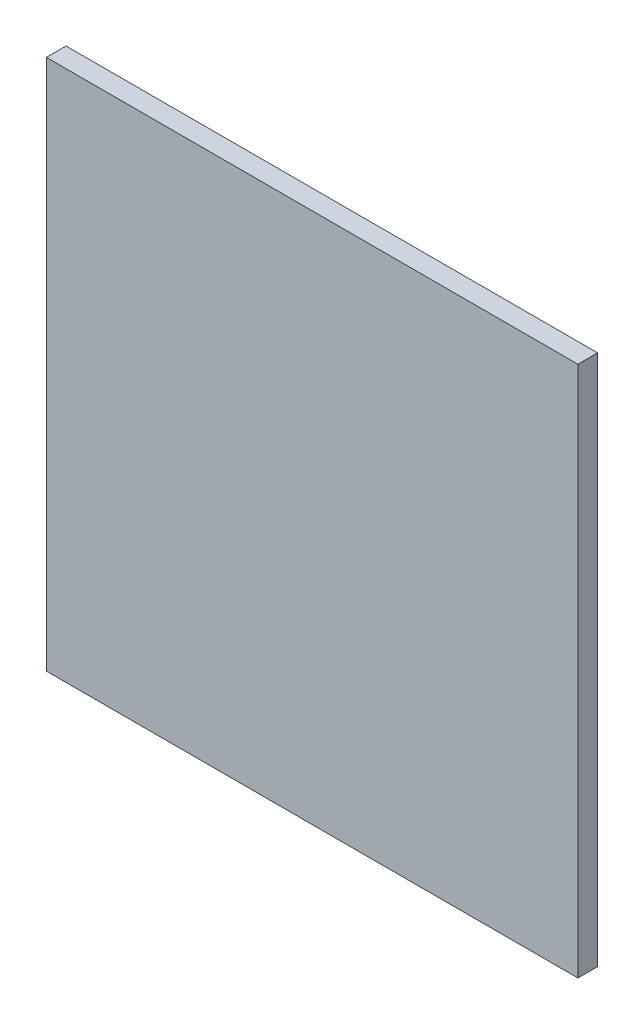
ISO-10303-21;
HEADER;
FILE_DESCRIPTION(('STEP AP214'),'2;1');
FILE_NAME('part.step','',(''),(''),'','','');
FILE_SCHEMA(('AUTOMOTIVE_DESIGN { 1 0 10303 214 1 1 1 1 }'));
ENDSEC;
DATA;
#1=APPLICATION_CONTEXT('core data for automotive mechanical design processes');
#2=APPLICATION_PROTOCOL_DEFINITION('international standard','automotive_design',2000,#1);
#3=PRODUCT_CONTEXT('',#1,'mechanical');
#4=PRODUCT('Part','Part','',(#3));
#5=PRODUCT_RELATED_PRODUCT_CATEGORY('part','',(#4));
#6=PRODUCT_DEFINITION_FORMATION('','',#4);
#7=PRODUCT_DEFINITION_CONTEXT('part definition',#1,'design');
#8=PRODUCT_DEFINITION('design','',#6,#7);
#9=PRODUCT_DEFINITION_SHAPE('','',#8);
#10=(LENGTH_UNIT() NAMED_UNIT(*) SI_UNIT(.MILLI.,.METRE.));
#11=(NAMED_UNIT(*) PLANE_ANGLE_UNIT() SI_UNIT($,.RADIAN.));
#12=(NAMED_UNIT(*) SI_UNIT($,.STERADIAN.) SOLID_ANGLE_UNIT());
#13=UNCERTAINTY_MEASURE_WITH_UNIT(LENGTH_MEASURE(1.E-05),#10,'distance_accuracy_value','');
#14=(GEOMETRIC_REPRESENTATION_CONTEXT(3) GLOBAL_UNCERTAINTY_ASSIGNED_CONTEXT((#13)) GLOBAL_UNIT_ASSIGNED_CONTEXT((#10,
#11,#12)) REPRESENTATION_CONTEXT('',''));
#15=CARTESIAN_POINT('',(0.,0.,0.));
#16=DIRECTION('',(0.,0.,1.));
#17=DIRECTION('',(1.,0.,0.));
#18=AXIS2_PLACEMENT_3D('',#15,#16,#17);
#19=CARTESIAN_POINT('',(171.45,-171.45,12.7));
#20=DIRECTION('',(-1.,0.,0.));
#21=DIRECTION('',(0.,0.,1.));
#22=AXIS2_PLACEMENT_3D('',#19,#20,#21);
#23=PLANE('',#22);
#24=DIRECTION('',(0.,1.,0.));
#25=VECTOR('',#24,1.);
#26=CARTESIAN_POINT('',(171.45,-171.45,0.));
#27=LINE('',#26,#25);
#28=CARTESIAN_POINT('',(171.45,-171.45,0.));
#29=VERTEX_POINT('',#28);
#30=CARTESIAN_POINT('',(171.45,171.45,0.));
#31=VERTEX_POINT('',#30);
#32=EDGE_CURVE('E96',#29,#31,#27,.T.);
#33=ORIENTED_EDGE('',*,*,#32,.T.);
#34=DIRECTION('',(0.,0.,-1.));
#35=VECTOR('',#34,1.);
#36=CARTESIAN_POINT('',(171.45,171.45,12.7));
#37=LINE('',#36,#35);
#38=CARTESIAN_POINT('',(171.45,171.45,12.7));
#39=VERTEX_POINT('',#38);
#40=EDGE_CURVE('E11',#39,#31,#37,.T.);
#41=ORIENTED_EDGE('',*,*,#40,.F.);
#42=DIRECTION('',(0.,1.,0.));
#43=VECTOR('',#42,1.);
#44=CARTESIAN_POINT('',(171.45,-171.45,12.7));
#45=LINE('',#44,#43);
#46=CARTESIAN_POINT('',(171.45,-171.45,12.7));
#47=VERTEX_POINT('',#46);
#48=EDGE_CURVE('E84',#47,#39,#45,.T.);
#49=ORIENTED_EDGE('',*,*,#48,.F.);
#50=DIRECTION('',(0.,0.,-1.));
#51=VECTOR('',#50,1.);
#52=CARTESIAN_POINT('',(171.45,-171.45,12.7));
#53=LINE('',#52,#51);
#54=EDGE_CURVE('E92',#47,#29,#53,.T.);
#55=ORIENTED_EDGE('',*,*,#54,.T.);
#56=EDGE_LOOP('',(#33,#41,#49,#55));
#57=FACE_BOUND('',#56,.T.);
#58=ADVANCED_FACE('F33',(#57),#23,.F.);
#59=CARTESIAN_POINT('',(-171.45,171.45,12.7));
#60=DIRECTION('',(0.,-1.,0.));
#61=DIRECTION('',(0.,0.,-1.));
#62=AXIS2_PLACEMENT_3D('',#59,#60,#61);
#63=PLANE('',#62);
#64=DIRECTION('',(-1.,0.,0.));
#65=VECTOR('',#64,1.);
#66=CARTESIAN_POINT('',(-171.45,171.45,0.));
#67=LINE('',#66,#65);
#68=CARTESIAN_POINT('',(-171.45,171.45,0.));
#69=VERTEX_POINT('',#68);
#70=EDGE_CURVE('E88',#31,#69,#67,.T.);
#71=ORIENTED_EDGE('',*,*,#70,.T.);
#72=DIRECTION('',(0.,0.,-1.));
#73=VECTOR('',#72,1.);
#74=CARTESIAN_POINT('',(-171.45,171.45,12.7));
#75=LINE('',#74,#73);
#76=CARTESIAN_POINT('',(-171.45,171.45,12.7));
#77=VERTEX_POINT('',#76);
#78=EDGE_CURVE('E41',#77,#69,#75,.T.);
#79=ORIENTED_EDGE('',*,*,#78,.F.);
#80=DIRECTION('',(-1.,0.,0.));
#81=VECTOR('',#80,1.);
#82=CARTESIAN_POINT('',(-171.45,171.45,12.7));
#83=LINE('',#82,#81);
#84=EDGE_CURVE('E79',#39,#77,#83,.T.);
#85=ORIENTED_EDGE('',*,*,#84,.F.);
#86=ORIENTED_EDGE('',*,*,#40,.T.);
#87=EDGE_LOOP('',(#71,#79,#85,#86));
#88=FACE_BOUND('',#87,.T.);
#89=ADVANCED_FACE('F87',(#88),#63,.F.);
#90=CARTESIAN_POINT('',(-171.45,-171.45,12.7));
#91=DIRECTION('',(1.,0.,0.));
#92=DIRECTION('',(0.,0.,-1.));
#93=AXIS2_PLACEMENT_3D('',#90,#91,#92);
#94=PLANE('',#93);
#95=DIRECTION('',(0.,-1.,0.));
#96=VECTOR('',#95,1.);
#97=CARTESIAN_POINT('',(-171.45,-171.45,0.));
#98=LINE('',#97,#96);
#99=CARTESIAN_POINT('',(-171.45,-171.45,0.));
#100=VERTEX_POINT('',#99);
#101=EDGE_CURVE('E66',#69,#100,#98,.T.);
#102=ORIENTED_EDGE('',*,*,#101,.T.);
#103=DIRECTION('',(0.,0.,-1.));
#104=VECTOR('',#103,1.);
#105=CARTESIAN_POINT('',(-171.45,-171.45,12.7));
#106=LINE('',#105,#104);
#107=CARTESIAN_POINT('',(-171.45,-171.45,12.7));
#108=VERTEX_POINT('',#107);
#109=EDGE_CURVE('E89',#108,#100,#106,.T.);
#110=ORIENTED_EDGE('',*,*,#109,.F.);
#111=DIRECTION('',(0.,-1.,0.));
#112=VECTOR('',#111,1.);
#113=CARTESIAN_POINT('',(-171.45,-171.45,12.7));
#114=LINE('',#113,#112);
#115=EDGE_CURVE('E82',#77,#108,#114,.T.);
#116=ORIENTED_EDGE('',*,*,#115,.F.);
#117=ORIENTED_EDGE('',*,*,#78,.T.);
#118=EDGE_LOOP('',(#102,#110,#116,#117));
#119=FACE_BOUND('',#118,.T.);
#120=ADVANCED_FACE('F90',(#119),#94,.F.);
#121=CARTESIAN_POINT('',(-171.45,-171.45,12.7));
#122=DIRECTION('',(0.,1.,0.));
#123=DIRECTION('',(0.,0.,1.));
#124=AXIS2_PLACEMENT_3D('',#121,#122,#123);
#125=PLANE('',#124);
#126=DIRECTION('',(1.,0.,0.));
#127=VECTOR('',#126,1.);
#128=CARTESIAN_POINT('',(-171.45,-171.45,0.));
#129=LINE('',#128,#127);
#130=EDGE_CURVE('E72',#100,#29,#129,.T.);
#131=ORIENTED_EDGE('',*,*,#130,.T.);
#132=ORIENTED_EDGE('',*,*,#54,.F.);
#133=DIRECTION('',(1.,0.,0.));
#134=VECTOR('',#133,1.);
#135=CARTESIAN_POINT('',(-171.45,-171.45,12.7));
#136=LINE('',#135,#134);
#137=EDGE_CURVE('E49',#108,#47,#136,.T.);
#138=ORIENTED_EDGE('',*,*,#137,.F.);
#139=ORIENTED_EDGE('',*,*,#109,.T.);
#140=EDGE_LOOP('',(#131,#132,#138,#139));
#141=FACE_BOUND('',#140,.T.);
#142=ADVANCED_FACE('F103',(#141),#125,.F.);
#143=CARTESIAN_POINT('',(0.,0.,12.7));
#144=DIRECTION('',(0.,0.,-1.));
#145=DIRECTION('',(-1.,0.,0.));
#146=AXIS2_PLACEMENT_3D('',#143,#144,#145);
#147=PLANE('',#146);
#148=ORIENTED_EDGE('',*,*,#48,.T.);
#149=ORIENTED_EDGE('',*,*,#84,.T.);
#150=ORIENTED_EDGE('',*,*,#115,.T.);
#151=ORIENTED_EDGE('',*,*,#137,.T.);
#152=EDGE_LOOP('',(#148,#149,#150,#151));
#153=FACE_BOUND('',#152,.T.);
#154=ADVANCED_FACE('F80',(#153),#147,.F.);
#155=CARTESIAN_POINT('',(0.,0.,0.));
#156=DIRECTION('',(0.,0.,-1.));
#157=DIRECTION('',(-1.,0.,0.));
#158=AXIS2_PLACEMENT_3D('',#155,#156,#157);
#159=PLANE('',#158);
#160=ORIENTED_EDGE('',*,*,#32,.F.);
#161=ORIENTED_EDGE('',*,*,#130,.F.);
#162=ORIENTED_EDGE('',*,*,#101,.F.);
#163=ORIENTED_EDGE('',*,*,#70,.F.);
#164=EDGE_LOOP('',(#160,#161,#162,#163));
#165=FACE_BOUND('',#164,.T.);
#166=ADVANCED_FACE('F106',(#165),#159,.T.);
#167=CLOSED_SHELL('',(#58,#89,#120,#142,#154,#166));
#168=MANIFOLD_SOLID_BREP('B2',#167);
#169=ADVANCED_BREP_SHAPE_REPRESENTATION('',(#18,#168),#14);
#170=SHAPE_DEFINITION_REPRESENTATION(#9,#169);
ENDSEC;
END-ISO-10303-21;
